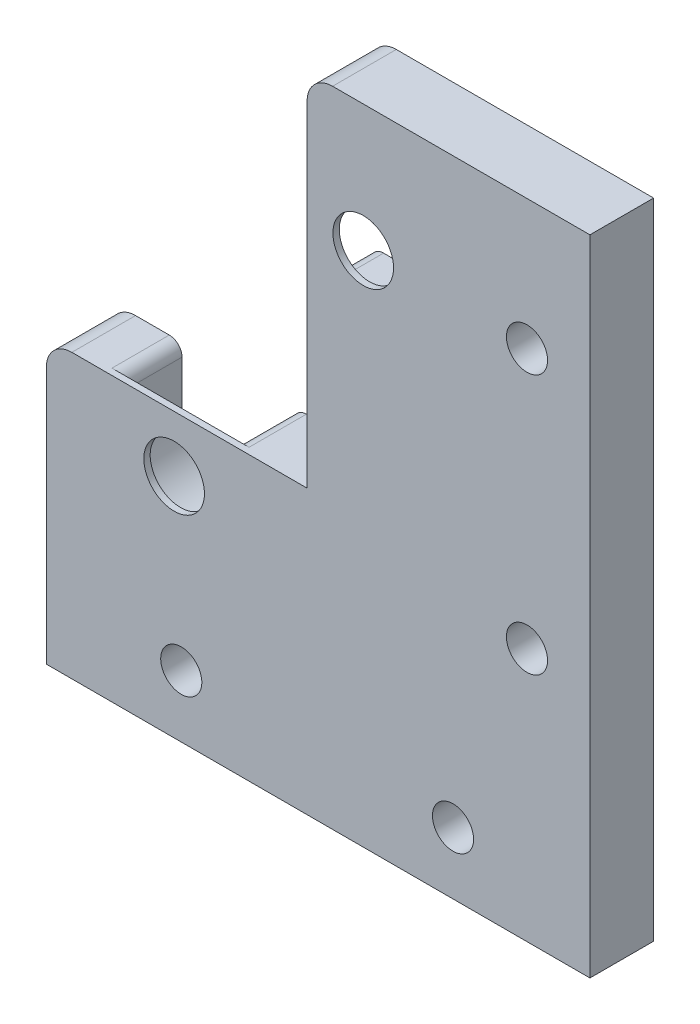
ISO-10303-21;
HEADER;
FILE_DESCRIPTION(('STEP AP214'),'2;1');
FILE_NAME('part.step','',(''),(''),'','','');
FILE_SCHEMA(('AUTOMOTIVE_DESIGN { 1 0 10303 214 1 1 1 1 }'));
ENDSEC;
DATA;
#1=APPLICATION_CONTEXT('core data for automotive mechanical design processes');
#2=APPLICATION_PROTOCOL_DEFINITION('international standard','automotive_design',2000,#1);
#3=PRODUCT_CONTEXT('',#1,'mechanical');
#4=PRODUCT('Part','Part','',(#3));
#5=PRODUCT_RELATED_PRODUCT_CATEGORY('part','',(#4));
#6=PRODUCT_DEFINITION_FORMATION('','',#4);
#7=PRODUCT_DEFINITION_CONTEXT('part definition',#1,'design');
#8=PRODUCT_DEFINITION('design','',#6,#7);
#9=PRODUCT_DEFINITION_SHAPE('','',#8);
#10=(LENGTH_UNIT() NAMED_UNIT(*) SI_UNIT(.MILLI.,.METRE.));
#11=(NAMED_UNIT(*) PLANE_ANGLE_UNIT() SI_UNIT($,.RADIAN.));
#12=(NAMED_UNIT(*) SI_UNIT($,.STERADIAN.) SOLID_ANGLE_UNIT());
#13=UNCERTAINTY_MEASURE_WITH_UNIT(LENGTH_MEASURE(1.E-05),#10,'distance_accuracy_value','');
#14=(GEOMETRIC_REPRESENTATION_CONTEXT(3) GLOBAL_UNCERTAINTY_ASSIGNED_CONTEXT((#13)) GLOBAL_UNIT_ASSIGNED_CONTEXT((#10,
#11,#12)) REPRESENTATION_CONTEXT('',''));
#15=CARTESIAN_POINT('',(0.,0.,0.));
#16=DIRECTION('',(0.,0.,1.));
#17=DIRECTION('',(1.,0.,0.));
#18=AXIS2_PLACEMENT_3D('',#15,#16,#17);
#19=CARTESIAN_POINT('',(-748.709029814981,576.941456971314,-80.6196));
#20=DIRECTION('',(0.,-1.,0.));
#21=DIRECTION('',(0.,0.,-1.));
#22=AXIS2_PLACEMENT_3D('',#19,#20,#21);
#23=PLANE('',#22);
#24=DIRECTION('',(-1.,0.,0.));
#25=VECTOR('',#24,1.);
#26=CARTESIAN_POINT('',(-748.709029814981,576.941456971314,-78.0796));
#27=LINE('',#26,#25);
#28=CARTESIAN_POINT('',(-748.150229814981,576.941456971314,-78.0796));
#29=VERTEX_POINT('',#28);
#30=CARTESIAN_POINT('',(-771.604989749061,576.941456971314,-78.0796));
#31=VERTEX_POINT('',#30);
#32=EDGE_CURVE('E376',#29,#31,#27,.T.);
#33=ORIENTED_EDGE('',*,*,#32,.F.);
#34=DIRECTION('',(0.,0.,1.));
#35=VECTOR('',#34,1.);
#36=CARTESIAN_POINT('',(-748.150229814981,576.941456971314,-80.6196));
#37=LINE('',#36,#35);
#38=CARTESIAN_POINT('',(-748.150229814981,576.941456971314,-84.4296));
#39=VERTEX_POINT('',#38);
#40=EDGE_CURVE('E390',#39,#29,#37,.T.);
#41=ORIENTED_EDGE('',*,*,#40,.F.);
#42=DIRECTION('',(-1.,0.,0.));
#43=VECTOR('',#42,1.);
#44=CARTESIAN_POINT('',(-748.150229814981,576.941456971314,-84.4296));
#45=LINE('',#44,#43);
#46=CARTESIAN_POINT('',(-754.576429814981,576.941456971314,-84.4296));
#47=VERTEX_POINT('',#46);
#48=EDGE_CURVE('E255',#39,#47,#45,.T.);
#49=ORIENTED_EDGE('',*,*,#48,.T.);
#50=DIRECTION('',(0.,0.,-1.));
#51=VECTOR('',#50,1.);
#52=CARTESIAN_POINT('',(-754.576429814981,576.941456971314,-80.6196));
#53=LINE('',#52,#51);
#54=CARTESIAN_POINT('',(-754.576429814981,576.941456971314,-78.7146));
#55=VERTEX_POINT('',#54);
#56=EDGE_CURVE('E433',#55,#47,#53,.T.);
#57=ORIENTED_EDGE('',*,*,#56,.F.);
#58=DIRECTION('',(-1.,0.,0.));
#59=VECTOR('',#58,1.);
#60=CARTESIAN_POINT('',(-1553.36997949812,576.941456971314,-78.7146));
#61=LINE('',#60,#59);
#62=CARTESIAN_POINT('',(-768.241629814981,576.941456971314,-78.7146));
#63=VERTEX_POINT('',#62);
#64=EDGE_CURVE('E293',#55,#63,#61,.T.);
#65=ORIENTED_EDGE('',*,*,#64,.T.);
#66=DIRECTION('',(0.,0.,-1.));
#67=VECTOR('',#66,1.);
#68=CARTESIAN_POINT('',(-768.241629814981,576.941456971314,-78.7146));
#69=LINE('',#68,#67);
#70=CARTESIAN_POINT('',(-768.241629814981,576.941456971314,-84.4296));
#71=VERTEX_POINT('',#70);
#72=EDGE_CURVE('E429',#71,#63,#69,.F.);
#73=ORIENTED_EDGE('',*,*,#72,.F.);
#74=CARTESIAN_POINT('',(-771.604989749061,576.941456971314,-84.4296));
#75=VERTEX_POINT('',#74);
#76=EDGE_CURVE('E357',#71,#75,#45,.T.);
#77=ORIENTED_EDGE('',*,*,#76,.T.);
#78=DIRECTION('',(0.,0.,1.));
#79=VECTOR('',#78,1.);
#80=CARTESIAN_POINT('',(-771.604989749061,576.941456971314,-84.4296));
#81=LINE('',#80,#79);
#82=EDGE_CURVE('E465',#31,#75,#81,.F.);
#83=ORIENTED_EDGE('',*,*,#82,.F.);
#84=EDGE_LOOP('',(#33,#41,#49,#57,#65,#73,#77,#83));
#85=FACE_BOUND('',#84,.T.);
#86=ADVANCED_FACE('F91',(#85),#23,.F.);
#87=CARTESIAN_POINT('',(-748.150229814981,612.913454217726,-80.6196));
#88=DIRECTION('',(1.,0.,0.));
#89=DIRECTION('',(0.,0.,1.));
#90=AXIS2_PLACEMENT_3D('',#87,#88,#89);
#91=PLANE('',#90);
#92=DIRECTION('',(0.,-1.,0.));
#93=VECTOR('',#92,1.);
#94=CARTESIAN_POINT('',(-748.150229814981,612.913454217726,-84.4296));
#95=LINE('',#94,#93);
#96=CARTESIAN_POINT('',(-748.150229814981,610.373454217725,-84.4296));
#97=VERTEX_POINT('',#96);
#98=CARTESIAN_POINT('',(-748.150229814981,607.091256971314,-84.4296));
#99=VERTEX_POINT('',#98);
#100=EDGE_CURVE('E353',#97,#99,#95,.T.);
#101=ORIENTED_EDGE('',*,*,#100,.T.);
#102=DIRECTION('',(0.,0.,-1.));
#103=VECTOR('',#102,1.);
#104=CARTESIAN_POINT('',(-748.150229814981,607.091256971314,-80.6196));
#105=LINE('',#104,#103);
#106=CARTESIAN_POINT('',(-748.150229814981,607.091256971314,-78.7146));
#107=VERTEX_POINT('',#106);
#108=EDGE_CURVE('E405',#107,#99,#105,.T.);
#109=ORIENTED_EDGE('',*,*,#108,.F.);
#110=DIRECTION('',(0.,-1.,0.));
#111=VECTOR('',#110,1.);
#112=CARTESIAN_POINT('',(-748.150229814981,0.,-78.7146));
#113=LINE('',#112,#111);
#114=CARTESIAN_POINT('',(-748.150229814981,593.426056971314,-78.7146));
#115=VERTEX_POINT('',#114);
#116=EDGE_CURVE('E342',#107,#115,#113,.T.);
#117=ORIENTED_EDGE('',*,*,#116,.T.);
#118=DIRECTION('',(0.,0.,-1.));
#119=VECTOR('',#118,1.);
#120=CARTESIAN_POINT('',(-748.150229814981,593.426056971314,-78.7146));
#121=LINE('',#120,#119);
#122=CARTESIAN_POINT('',(-748.150229814981,593.426056971314,-84.4296));
#123=VERTEX_POINT('',#122);
#124=EDGE_CURVE('E394',#123,#115,#121,.F.);
#125=ORIENTED_EDGE('',*,*,#124,.F.);
#126=EDGE_CURVE('E358',#123,#39,#95,.T.);
#127=ORIENTED_EDGE('',*,*,#126,.T.);
#128=ORIENTED_EDGE('',*,*,#40,.T.);
#129=DIRECTION('',(0.,-1.,0.));
#130=VECTOR('',#129,1.);
#131=CARTESIAN_POINT('',(-748.150229814981,612.913454217726,-78.0796));
#132=LINE('',#131,#130);
#133=CARTESIAN_POINT('',(-748.150229814981,610.373454217725,-78.0796));
#134=VERTEX_POINT('',#133);
#135=EDGE_CURVE('E387',#134,#29,#132,.T.);
#136=ORIENTED_EDGE('',*,*,#135,.F.);
#137=DIRECTION('',(0.,0.,1.));
#138=VECTOR('',#137,1.);
#139=CARTESIAN_POINT('',(-748.150229814981,610.373454217725,-78.0796));
#140=LINE('',#139,#138);
#141=EDGE_CURVE('E474',#97,#134,#140,.T.);
#142=ORIENTED_EDGE('',*,*,#141,.F.);
#143=EDGE_LOOP('',(#101,#109,#117,#125,#127,#128,#136,#142));
#144=FACE_BOUND('',#143,.T.);
#145=ADVANCED_FACE('F521',(#144),#91,.F.);
#146=CARTESIAN_POINT('',(-761.409029814981,571.347106971314,-78.0796));
#147=DIRECTION('',(0.,0.,-1.));
#148=DIRECTION('',(1.,0.,0.));
#149=AXIS2_PLACEMENT_3D('',#146,#147,#148);
#150=CYLINDRICAL_SURFACE('',#149,3.0226);
#151=CARTESIAN_POINT('',(-761.409029814981,571.347106971314,-78.7146));
#152=DIRECTION('',(0.,0.,1.));
#153=DIRECTION('',(1.,0.,0.));
#154=AXIS2_PLACEMENT_3D('',#151,#152,#153);
#155=CIRCLE('',#154,3.0226);
#156=CARTESIAN_POINT('',(-758.386429814981,571.347106971314,-78.7146));
#157=VERTEX_POINT('',#156);
#158=EDGE_CURVE('E398',#157,#157,#155,.F.);
#159=ORIENTED_EDGE('',*,*,#158,.T.);
#160=DIRECTION('',(0.,0.,-1.));
#161=VECTOR('',#160,1.);
#162=CARTESIAN_POINT('',(-758.386429814981,571.347106971314,-78.0796));
#163=LINE('',#162,#161);
#164=CARTESIAN_POINT('',(-758.386429814981,571.347106971314,-78.0796));
#165=VERTEX_POINT('',#164);
#166=EDGE_CURVE('E373',#165,#157,#163,.T.);
#167=ORIENTED_EDGE('',*,*,#166,.F.);
#168=CARTESIAN_POINT('',(-761.409029814981,571.347106971314,-78.0796));
#169=DIRECTION('',(0.,0.,-1.));
#170=DIRECTION('',(1.,0.,0.));
#171=AXIS2_PLACEMENT_3D('',#168,#169,#170);
#172=CIRCLE('',#171,3.0226);
#173=EDGE_CURVE('E370',#165,#165,#172,.T.);
#174=ORIENTED_EDGE('',*,*,#173,.F.);
#175=ORIENTED_EDGE('',*,*,#166,.T.);
#176=EDGE_LOOP('',(#159,#167,#174,#175));
#177=FACE_BOUND('',#176,.T.);
#178=ADVANCED_FACE('F527',(#177),#150,.F.);
#179=CARTESIAN_POINT('',(-742.555879814981,600.258656971314,-78.0796));
#180=DIRECTION('',(0.,0.,-1.));
#181=DIRECTION('',(1.,0.,0.));
#182=AXIS2_PLACEMENT_3D('',#179,#180,#181);
#183=CYLINDRICAL_SURFACE('',#182,3.0226);
#184=CARTESIAN_POINT('',(-742.555879814981,600.258656971314,-78.7146));
#185=DIRECTION('',(0.,0.,1.));
#186=DIRECTION('',(1.,0.,0.));
#187=AXIS2_PLACEMENT_3D('',#184,#185,#186);
#188=CIRCLE('',#187,3.0226);
#189=CARTESIAN_POINT('',(-739.53327981498,600.258656971314,-78.7146));
#190=VERTEX_POINT('',#189);
#191=EDGE_CURVE('E317',#190,#190,#188,.F.);
#192=ORIENTED_EDGE('',*,*,#191,.T.);
#193=DIRECTION('',(0.,0.,-1.));
#194=VECTOR('',#193,1.);
#195=CARTESIAN_POINT('',(-739.53327981498,600.258656971314,-78.0796));
#196=LINE('',#195,#194);
#197=CARTESIAN_POINT('',(-739.533279814981,600.258656971314,-78.0796));
#198=VERTEX_POINT('',#197);
#199=EDGE_CURVE('E367',#198,#190,#196,.T.);
#200=ORIENTED_EDGE('',*,*,#199,.F.);
#201=CARTESIAN_POINT('',(-742.555879814981,600.258656971314,-78.0796));
#202=DIRECTION('',(0.,0.,-1.));
#203=DIRECTION('',(1.,0.,0.));
#204=AXIS2_PLACEMENT_3D('',#201,#202,#203);
#205=CIRCLE('',#204,3.0226);
#206=EDGE_CURVE('E364',#198,#198,#205,.T.);
#207=ORIENTED_EDGE('',*,*,#206,.F.);
#208=ORIENTED_EDGE('',*,*,#199,.T.);
#209=EDGE_LOOP('',(#192,#200,#207,#208));
#210=FACE_BOUND('',#209,.T.);
#211=ADVANCED_FACE('F510',(#210),#183,.F.);
#212=CARTESIAN_POINT('',(-1553.36997949812,0.,-84.4296));
#213=DIRECTION('',(0.,0.,1.));
#214=DIRECTION('',(-1.,0.,0.));
#215=AXIS2_PLACEMENT_3D('',#212,#213,#214);
#216=PLANE('',#215);
#217=CARTESIAN_POINT('',(-760.699399765524,554.919656971296,-84.4296));
#218=DIRECTION('',(0.,0.,1.));
#219=DIRECTION('',(1.,0.,0.));
#220=AXIS2_PLACEMENT_3D('',#217,#218,#219);
#221=CIRCLE('',#220,3.31999999999999);
#222=CARTESIAN_POINT('',(-757.379399765524,554.919656971296,-84.4296));
#223=VERTEX_POINT('',#222);
#224=EDGE_CURVE('E488',#223,#223,#221,.T.);
#225=ORIENTED_EDGE('',*,*,#224,.T.);
#226=EDGE_LOOP('',(#225));
#227=FACE_BOUND('',#226,.T.);
#228=CARTESIAN_POINT('',(-733.605019798484,554.919656971296,-84.4296));
#229=DIRECTION('',(0.,0.,1.));
#230=DIRECTION('',(1.,0.,0.));
#231=AXIS2_PLACEMENT_3D('',#228,#229,#230);
#232=CIRCLE('',#231,3.31999999999999);
#233=CARTESIAN_POINT('',(-730.285019798484,554.919656971296,-84.4296));
#234=VERTEX_POINT('',#233);
#235=EDGE_CURVE('E485',#234,#234,#232,.T.);
#236=ORIENTED_EDGE('',*,*,#235,.T.);
#237=EDGE_LOOP('',(#236));
#238=FACE_BOUND('',#237,.T.);
#239=CARTESIAN_POINT('',(-726.230029814964,574.047256282899,-84.4296));
#240=DIRECTION('',(0.,0.,1.));
#241=DIRECTION('',(1.,0.,0.));
#242=AXIS2_PLACEMENT_3D('',#239,#240,#241);
#243=CIRCLE('',#242,3.31999999999999);
#244=CARTESIAN_POINT('',(-722.910029814964,574.047256282899,-84.4296));
#245=VERTEX_POINT('',#244);
#246=EDGE_CURVE('E482',#245,#245,#243,.T.);
#247=ORIENTED_EDGE('',*,*,#246,.T.);
#248=EDGE_LOOP('',(#247));
#249=FACE_BOUND('',#248,.T.);
#250=CARTESIAN_POINT('',(-726.230029814964,599.958054906104,-84.4296));
#251=DIRECTION('',(0.,0.,1.));
#252=DIRECTION('',(1.,0.,0.));
#253=AXIS2_PLACEMENT_3D('',#250,#251,#252);
#254=CIRCLE('',#253,3.31999999999999);
#255=CARTESIAN_POINT('',(-722.910029814964,599.958054906104,-84.4296));
#256=VERTEX_POINT('',#255);
#257=EDGE_CURVE('E479',#256,#256,#254,.T.);
#258=ORIENTED_EDGE('',*,*,#257,.T.);
#259=EDGE_LOOP('',(#258));
#260=FACE_BOUND('',#259,.T.);
#261=DIRECTION('',(-1.,0.,0.));
#262=VECTOR('',#261,1.);
#263=CARTESIAN_POINT('',(-726.30622981498,612.913454217726,-84.4296));
#264=LINE('',#263,#262);
#265=CARTESIAN_POINT('',(-719.956229814987,612.91345421773,-84.4296));
#266=VERTEX_POINT('',#265);
#267=CARTESIAN_POINT('',(-745.610229814981,612.913454217726,-84.4296));
#268=VERTEX_POINT('',#267);
#269=EDGE_CURVE('E254',#266,#268,#264,.T.);
#270=ORIENTED_EDGE('',*,*,#269,.F.);
#271=DIRECTION('',(0.,-1.,0.));
#272=VECTOR('',#271,1.);
#273=CARTESIAN_POINT('',(-719.956229815,2.51751805689119E-11,-84.4296));
#274=LINE('',#273,#272);
#275=CARTESIAN_POINT('',(-719.95622981498,548.747456971314,-84.4296));
#276=VERTEX_POINT('',#275);
#277=EDGE_CURVE('E266',#266,#276,#274,.T.);
#278=ORIENTED_EDGE('',*,*,#277,.T.);
#279=DIRECTION('',(-1.,0.,0.));
#280=VECTOR('',#279,1.);
#281=CARTESIAN_POINT('',(0.,548.747456971314,-84.4296));
#282=LINE('',#281,#280);
#283=CARTESIAN_POINT('',(-774.144989749061,548.747456971314,-84.4296));
#284=VERTEX_POINT('',#283);
#285=EDGE_CURVE('E262',#276,#284,#282,.T.);
#286=ORIENTED_EDGE('',*,*,#285,.T.);
#287=DIRECTION('',(0.,-1.,0.));
#288=VECTOR('',#287,1.);
#289=CARTESIAN_POINT('',(-774.144989749061,576.941456971314,-84.4296));
#290=LINE('',#289,#288);
#291=CARTESIAN_POINT('',(-774.144989749061,574.401456971314,-84.4296));
#292=VERTEX_POINT('',#291);
#293=EDGE_CURVE('E243',#292,#284,#290,.T.);
#294=ORIENTED_EDGE('',*,*,#293,.F.);
#295=CARTESIAN_POINT('',(-771.604989749061,574.401456971314,-84.4296));
#296=DIRECTION('',(0.,0.,-1.));
#297=DIRECTION('',(-1.,0.,0.));
#298=AXIS2_PLACEMENT_3D('',#295,#296,#297);
#299=CIRCLE('',#298,2.54);
#300=EDGE_CURVE('E471',#75,#292,#299,.F.);
#301=ORIENTED_EDGE('',*,*,#300,.F.);
#302=ORIENTED_EDGE('',*,*,#76,.F.);
#303=CARTESIAN_POINT('',(-768.241629814981,575.671456971314,-84.4296));
#304=DIRECTION('',(0.,0.,-1.));
#305=DIRECTION('',(-1.,0.,0.));
#306=AXIS2_PLACEMENT_3D('',#303,#304,#305);
#307=CIRCLE('',#306,1.27);
#308=CARTESIAN_POINT('',(-766.971629814981,575.671456971314,-84.4296));
#309=VERTEX_POINT('',#308);
#310=EDGE_CURVE('E409',#309,#71,#307,.F.);
#311=ORIENTED_EDGE('',*,*,#310,.F.);
#312=DIRECTION('',(0.,1.,0.));
#313=VECTOR('',#312,1.);
#314=CARTESIAN_POINT('',(-766.971629814981,0.,-84.4296));
#315=LINE('',#314,#313);
#316=CARTESIAN_POINT('',(-766.971629814981,571.347106971314,-84.4296));
#317=VERTEX_POINT('',#316);
#318=EDGE_CURVE('E289',#317,#309,#315,.T.);
#319=ORIENTED_EDGE('',*,*,#318,.F.);
#320=CARTESIAN_POINT('',(-761.409029814981,571.347106971314,-84.4296));
#321=DIRECTION('',(0.,0.,1.));
#322=DIRECTION('',(1.,0.,0.));
#323=AXIS2_PLACEMENT_3D('',#320,#321,#322);
#324=CIRCLE('',#323,5.5626);
#325=CARTESIAN_POINT('',(-755.846429814981,571.347106971314,-84.4296));
#326=VERTEX_POINT('',#325);
#327=EDGE_CURVE('E302',#317,#326,#324,.T.);
#328=ORIENTED_EDGE('',*,*,#327,.T.);
#329=DIRECTION('',(0.,1.,0.));
#330=VECTOR('',#329,1.);
#331=CARTESIAN_POINT('',(-755.846429814981,0.,-84.4296));
#332=LINE('',#331,#330);
#333=CARTESIAN_POINT('',(-755.846429814981,575.671456971314,-84.4296));
#334=VERTEX_POINT('',#333);
#335=EDGE_CURVE('E306',#326,#334,#332,.T.);
#336=ORIENTED_EDGE('',*,*,#335,.T.);
#337=CARTESIAN_POINT('',(-754.576429814981,575.671456971314,-84.4296));
#338=DIRECTION('',(0.,0.,-1.));
#339=DIRECTION('',(-1.,0.,0.));
#340=AXIS2_PLACEMENT_3D('',#337,#338,#339);
#341=CIRCLE('',#340,1.27);
#342=EDGE_CURVE('E412',#47,#334,#341,.F.);
#343=ORIENTED_EDGE('',*,*,#342,.F.);
#344=ORIENTED_EDGE('',*,*,#48,.F.);
#345=ORIENTED_EDGE('',*,*,#126,.F.);
#346=CARTESIAN_POINT('',(-746.880229814981,593.426056971314,-84.4296));
#347=DIRECTION('',(0.,0.,-1.));
#348=DIRECTION('',(-1.,0.,0.));
#349=AXIS2_PLACEMENT_3D('',#346,#347,#348);
#350=CIRCLE('',#349,1.27);
#351=CARTESIAN_POINT('',(-746.880229814981,594.696056971314,-84.4296));
#352=VERTEX_POINT('',#351);
#353=EDGE_CURVE('E416',#352,#123,#350,.F.);
#354=ORIENTED_EDGE('',*,*,#353,.F.);
#355=DIRECTION('',(-1.,0.,0.));
#356=VECTOR('',#355,1.);
#357=CARTESIAN_POINT('',(-1553.36997949812,594.696056971314,-84.4296));
#358=LINE('',#357,#356);
#359=CARTESIAN_POINT('',(-742.555879814981,594.696056971314,-84.4296));
#360=VERTEX_POINT('',#359);
#361=EDGE_CURVE('E327',#360,#352,#358,.T.);
#362=ORIENTED_EDGE('',*,*,#361,.F.);
#363=CARTESIAN_POINT('',(-742.555879814981,600.258656971314,-84.4296));
#364=DIRECTION('',(0.,0.,1.));
#365=DIRECTION('',(1.,0.,0.));
#366=AXIS2_PLACEMENT_3D('',#363,#364,#365);
#367=CIRCLE('',#366,5.56260000000014);
#368=CARTESIAN_POINT('',(-742.555879814981,605.821256971314,-84.4296));
#369=VERTEX_POINT('',#368);
#370=EDGE_CURVE('E307',#360,#369,#367,.T.);
#371=ORIENTED_EDGE('',*,*,#370,.T.);
#372=DIRECTION('',(-1.,0.,0.));
#373=VECTOR('',#372,1.);
#374=CARTESIAN_POINT('',(-1553.36997949812,605.821256971314,-84.4296));
#375=LINE('',#374,#373);
#376=CARTESIAN_POINT('',(-746.880229814981,605.821256971314,-84.4296));
#377=VERTEX_POINT('',#376);
#378=EDGE_CURVE('E331',#369,#377,#375,.T.);
#379=ORIENTED_EDGE('',*,*,#378,.T.);
#380=CARTESIAN_POINT('',(-746.880229814981,607.091256971314,-84.4296));
#381=DIRECTION('',(0.,0.,-1.));
#382=DIRECTION('',(-1.,0.,0.));
#383=AXIS2_PLACEMENT_3D('',#380,#381,#382);
#384=CIRCLE('',#383,1.27);
#385=EDGE_CURVE('E419',#99,#377,#384,.F.);
#386=ORIENTED_EDGE('',*,*,#385,.F.);
#387=ORIENTED_EDGE('',*,*,#100,.F.);
#388=CARTESIAN_POINT('',(-745.610229814981,610.373454217725,-84.4296));
#389=DIRECTION('',(0.,0.,-1.));
#390=DIRECTION('',(-1.,0.,0.));
#391=AXIS2_PLACEMENT_3D('',#388,#389,#390);
#392=CIRCLE('',#391,2.54);
#393=EDGE_CURVE('E112',#268,#97,#392,.F.);
#394=ORIENTED_EDGE('',*,*,#393,.F.);
#395=EDGE_LOOP('',(#270,#278,#286,#294,#301,#302,#311,#319,#328,#336,#343,#344,#345,#354,#362,
#371,#379,#386,#387,#394));
#396=FACE_BOUND('',#395,.T.);
#397=ADVANCED_FACE('F268',(#227,#238,#249,#260,#396),#216,.F.);
#398=CARTESIAN_POINT('',(-774.144989749061,0.,6.35));
#399=DIRECTION('',(-1.,0.,0.));
#400=DIRECTION('',(0.,0.,-1.));
#401=AXIS2_PLACEMENT_3D('',#398,#399,#400);
#402=PLANE('',#401);
#403=DIRECTION('',(0.,-1.,0.));
#404=VECTOR('',#403,1.);
#405=CARTESIAN_POINT('',(-774.144989749061,562.158656971314,-78.0796));
#406=LINE('',#405,#404);
#407=CARTESIAN_POINT('',(-774.144989749061,574.401456971314,-78.0796));
#408=VERTEX_POINT('',#407);
#409=CARTESIAN_POINT('',(-774.144989749061,548.747456971314,-78.0796));
#410=VERTEX_POINT('',#409);
#411=EDGE_CURVE('E380',#408,#410,#406,.T.);
#412=ORIENTED_EDGE('',*,*,#411,.F.);
#413=DIRECTION('',(0.,0.,1.));
#414=VECTOR('',#413,1.);
#415=CARTESIAN_POINT('',(-774.144989749061,574.401456971314,-78.0796));
#416=LINE('',#415,#414);
#417=EDGE_CURVE('E249',#292,#408,#416,.T.);
#418=ORIENTED_EDGE('',*,*,#417,.F.);
#419=ORIENTED_EDGE('',*,*,#293,.T.);
#420=DIRECTION('',(0.,0.,-1.));
#421=VECTOR('',#420,1.);
#422=CARTESIAN_POINT('',(-774.144989749061,548.747456971314,5.90668998723819));
#423=LINE('',#422,#421);
#424=EDGE_CURVE('E247',#410,#284,#423,.T.);
#425=ORIENTED_EDGE('',*,*,#424,.F.);
#426=EDGE_LOOP('',(#412,#418,#419,#425));
#427=FACE_BOUND('',#426,.T.);
#428=ADVANCED_FACE('F246',(#427),#402,.T.);
#429=CARTESIAN_POINT('',(-1553.36997949812,612.913454217726,6.35));
#430=DIRECTION('',(0.,1.,0.));
#431=DIRECTION('',(0.,0.,1.));
#432=AXIS2_PLACEMENT_3D('',#429,#430,#431);
#433=PLANE('',#432);
#434=DIRECTION('',(-1.,0.,0.));
#435=VECTOR('',#434,1.);
#436=CARTESIAN_POINT('',(-733.367429814981,612.913454217726,-78.0796));
#437=LINE('',#436,#435);
#438=CARTESIAN_POINT('',(-719.956229814987,612.91345421773,-78.0796));
#439=VERTEX_POINT('',#438);
#440=CARTESIAN_POINT('',(-745.610229814981,612.913454217726,-78.0796));
#441=VERTEX_POINT('',#440);
#442=EDGE_CURVE('E383',#439,#441,#437,.T.);
#443=ORIENTED_EDGE('',*,*,#442,.F.);
#444=DIRECTION('',(0.,0.,-1.));
#445=VECTOR('',#444,1.);
#446=CARTESIAN_POINT('',(-719.956229814987,612.91345421773,5.90668998723819));
#447=LINE('',#446,#445);
#448=EDGE_CURVE('E265',#439,#266,#447,.T.);
#449=ORIENTED_EDGE('',*,*,#448,.T.);
#450=ORIENTED_EDGE('',*,*,#269,.T.);
#451=DIRECTION('',(0.,0.,1.));
#452=VECTOR('',#451,1.);
#453=CARTESIAN_POINT('',(-745.610229814981,612.913454217726,-84.4296));
#454=LINE('',#453,#452);
#455=EDGE_CURVE('E107',#441,#268,#454,.F.);
#456=ORIENTED_EDGE('',*,*,#455,.F.);
#457=EDGE_LOOP('',(#443,#449,#450,#456));
#458=FACE_BOUND('',#457,.T.);
#459=ADVANCED_FACE('F533',(#458),#433,.T.);
#460=CARTESIAN_POINT('',(-1553.36997949812,0.,-78.0796));
#461=DIRECTION('',(0.,0.,-1.));
#462=DIRECTION('',(1.,0.,0.));
#463=AXIS2_PLACEMENT_3D('',#460,#461,#462);
#464=PLANE('',#463);
#465=CARTESIAN_POINT('',(-760.699399765524,554.919656971296,-78.0796));
#466=DIRECTION('',(0.,0.,-1.));
#467=DIRECTION('',(-1.,0.,0.));
#468=AXIS2_PLACEMENT_3D('',#465,#466,#467);
#469=CIRCLE('',#468,2.05000000000004);
#470=CARTESIAN_POINT('',(-762.749399765524,554.919656971296,-78.0796));
#471=VERTEX_POINT('',#470);
#472=EDGE_CURVE('E270',#471,#471,#469,.F.);
#473=ORIENTED_EDGE('',*,*,#472,.F.);
#474=EDGE_LOOP('',(#473));
#475=FACE_BOUND('',#474,.T.);
#476=CARTESIAN_POINT('',(-733.605019798484,554.919656971296,-78.0796));
#477=DIRECTION('',(0.,0.,-1.));
#478=DIRECTION('',(-1.,0.,0.));
#479=AXIS2_PLACEMENT_3D('',#476,#477,#478);
#480=CIRCLE('',#479,2.05000000000004);
#481=CARTESIAN_POINT('',(-735.655019798484,554.919656971296,-78.0796));
#482=VERTEX_POINT('',#481);
#483=EDGE_CURVE('E274',#482,#482,#480,.F.);
#484=ORIENTED_EDGE('',*,*,#483,.F.);
#485=EDGE_LOOP('',(#484));
#486=FACE_BOUND('',#485,.T.);
#487=CARTESIAN_POINT('',(-726.230029814964,574.047256282899,-78.0796));
#488=DIRECTION('',(0.,0.,-1.));
#489=DIRECTION('',(-1.,0.,0.));
#490=AXIS2_PLACEMENT_3D('',#487,#488,#489);
#491=CIRCLE('',#490,2.05000000000004);
#492=CARTESIAN_POINT('',(-728.280029814964,574.047256282899,-78.0796));
#493=VERTEX_POINT('',#492);
#494=EDGE_CURVE('E596',#493,#493,#491,.F.);
#495=ORIENTED_EDGE('',*,*,#494,.F.);
#496=EDGE_LOOP('',(#495));
#497=FACE_BOUND('',#496,.T.);
#498=CARTESIAN_POINT('',(-726.230029814964,599.958054906104,-78.0796));
#499=DIRECTION('',(0.,0.,-1.));
#500=DIRECTION('',(-1.,0.,0.));
#501=AXIS2_PLACEMENT_3D('',#498,#499,#500);
#502=CIRCLE('',#501,2.05000000000004);
#503=CARTESIAN_POINT('',(-728.280029814964,599.958054906104,-78.0796));
#504=VERTEX_POINT('',#503);
#505=EDGE_CURVE('E599',#504,#504,#502,.F.);
#506=ORIENTED_EDGE('',*,*,#505,.F.);
#507=EDGE_LOOP('',(#506));
#508=FACE_BOUND('',#507,.T.);
#509=ORIENTED_EDGE('',*,*,#442,.T.);
#510=CARTESIAN_POINT('',(-745.610229814981,610.373454217725,-78.0796));
#511=DIRECTION('',(0.,0.,1.));
#512=DIRECTION('',(1.,0.,0.));
#513=AXIS2_PLACEMENT_3D('',#510,#511,#512);
#514=CIRCLE('',#513,2.54);
#515=EDGE_CURVE('E459',#134,#441,#514,.F.);
#516=ORIENTED_EDGE('',*,*,#515,.F.);
#517=ORIENTED_EDGE('',*,*,#135,.T.);
#518=ORIENTED_EDGE('',*,*,#32,.T.);
#519=CARTESIAN_POINT('',(-771.604989749061,574.401456971314,-78.0796));
#520=DIRECTION('',(0.,0.,1.));
#521=DIRECTION('',(1.,0.,0.));
#522=AXIS2_PLACEMENT_3D('',#519,#520,#521);
#523=CIRCLE('',#522,2.54);
#524=EDGE_CURVE('E462',#408,#31,#523,.F.);
#525=ORIENTED_EDGE('',*,*,#524,.F.);
#526=ORIENTED_EDGE('',*,*,#411,.T.);
#527=DIRECTION('',(1.,0.,0.));
#528=VECTOR('',#527,1.);
#529=CARTESIAN_POINT('',(0.,548.747456971314,-78.0796));
#530=LINE('',#529,#528);
#531=CARTESIAN_POINT('',(-719.95622981498,548.747456971314,-78.0796));
#532=VERTEX_POINT('',#531);
#533=EDGE_CURVE('E264',#410,#532,#530,.T.);
#534=ORIENTED_EDGE('',*,*,#533,.T.);
#535=DIRECTION('',(0.,1.,0.));
#536=VECTOR('',#535,1.);
#537=CARTESIAN_POINT('',(-719.956229815,2.51751805689119E-11,-78.0796));
#538=LINE('',#537,#536);
#539=EDGE_CURVE('E281',#532,#439,#538,.T.);
#540=ORIENTED_EDGE('',*,*,#539,.T.);
#541=EDGE_LOOP('',(#509,#516,#517,#518,#525,#526,#534,#540));
#542=FACE_BOUND('',#541,.T.);
#543=ORIENTED_EDGE('',*,*,#206,.T.);
#544=EDGE_LOOP('',(#543));
#545=FACE_BOUND('',#544,.T.);
#546=ORIENTED_EDGE('',*,*,#173,.T.);
#547=EDGE_LOOP('',(#546));
#548=FACE_BOUND('',#547,.T.);
#549=ADVANCED_FACE('F536',(#475,#486,#497,#508,#542,#545,#548),#464,.F.);
#550=CARTESIAN_POINT('',(-1553.36997949812,0.,-78.7146));
#551=DIRECTION('',(0.,0.,-1.));
#552=DIRECTION('',(1.,0.,0.));
#553=AXIS2_PLACEMENT_3D('',#550,#551,#552);
#554=PLANE('',#553);
#555=CARTESIAN_POINT('',(-742.555879814981,600.258656971314,-78.7146));
#556=DIRECTION('',(0.,0.,1.));
#557=DIRECTION('',(1.,0.,0.));
#558=AXIS2_PLACEMENT_3D('',#555,#556,#557);
#559=CIRCLE('',#558,5.56260000000014);
#560=CARTESIAN_POINT('',(-742.555879814981,594.696056971314,-78.7146));
#561=VERTEX_POINT('',#560);
#562=CARTESIAN_POINT('',(-742.555879814981,605.821256971314,-78.7146));
#563=VERTEX_POINT('',#562);
#564=EDGE_CURVE('E332',#561,#563,#559,.T.);
#565=ORIENTED_EDGE('',*,*,#564,.F.);
#566=DIRECTION('',(-1.,0.,0.));
#567=VECTOR('',#566,1.);
#568=CARTESIAN_POINT('',(-1553.36997949812,594.696056971314,-78.7146));
#569=LINE('',#568,#567);
#570=CARTESIAN_POINT('',(-746.880229814981,594.696056971314,-78.7146));
#571=VERTEX_POINT('',#570);
#572=EDGE_CURVE('E323',#561,#571,#569,.T.);
#573=ORIENTED_EDGE('',*,*,#572,.T.);
#574=CARTESIAN_POINT('',(-746.880229814981,593.426056971314,-78.7146));
#575=DIRECTION('',(0.,0.,1.));
#576=DIRECTION('',(1.,0.,0.));
#577=AXIS2_PLACEMENT_3D('',#574,#575,#576);
#578=CIRCLE('',#577,1.27);
#579=EDGE_CURVE('E446',#115,#571,#578,.F.);
#580=ORIENTED_EDGE('',*,*,#579,.F.);
#581=ORIENTED_EDGE('',*,*,#116,.F.);
#582=CARTESIAN_POINT('',(-746.880229814981,607.091256971314,-78.7146));
#583=DIRECTION('',(0.,0.,1.));
#584=DIRECTION('',(1.,0.,0.));
#585=AXIS2_PLACEMENT_3D('',#582,#583,#584);
#586=CIRCLE('',#585,1.27);
#587=CARTESIAN_POINT('',(-746.880229814981,605.821256971314,-78.7146));
#588=VERTEX_POINT('',#587);
#589=EDGE_CURVE('E443',#588,#107,#586,.F.);
#590=ORIENTED_EDGE('',*,*,#589,.F.);
#591=DIRECTION('',(-1.,0.,0.));
#592=VECTOR('',#591,1.);
#593=CARTESIAN_POINT('',(-1553.36997949812,605.821256971314,-78.7146));
#594=LINE('',#593,#592);
#595=EDGE_CURVE('E346',#563,#588,#594,.T.);
#596=ORIENTED_EDGE('',*,*,#595,.F.);
#597=EDGE_LOOP('',(#565,#573,#580,#581,#590,#596));
#598=FACE_BOUND('',#597,.T.);
#599=ORIENTED_EDGE('',*,*,#191,.F.);
#600=EDGE_LOOP('',(#599));
#601=FACE_BOUND('',#600,.T.);
#602=ADVANCED_FACE('F654',(#598,#601),#554,.T.);
#603=CARTESIAN_POINT('',(-742.555879814981,600.258656971314,-78.7146));
#604=DIRECTION('',(0.,0.,-1.));
#605=DIRECTION('',(1.,0.,0.));
#606=AXIS2_PLACEMENT_3D('',#603,#604,#605);
#607=CYLINDRICAL_SURFACE('',#606,5.56260000000014);
#608=ORIENTED_EDGE('',*,*,#370,.F.);
#609=DIRECTION('',(0.,0.,-1.));
#610=VECTOR('',#609,1.);
#611=CARTESIAN_POINT('',(-742.555879814981,594.696056971314,-78.7146));
#612=LINE('',#611,#610);
#613=EDGE_CURVE('E324',#561,#360,#612,.T.);
#614=ORIENTED_EDGE('',*,*,#613,.F.);
#615=ORIENTED_EDGE('',*,*,#564,.T.);
#616=DIRECTION('',(0.,0.,-1.));
#617=VECTOR('',#616,1.);
#618=CARTESIAN_POINT('',(-742.555879814981,605.821256971314,-78.7146));
#619=LINE('',#618,#617);
#620=EDGE_CURVE('E320',#563,#369,#619,.T.);
#621=ORIENTED_EDGE('',*,*,#620,.T.);
#622=EDGE_LOOP('',(#608,#614,#615,#621));
#623=FACE_BOUND('',#622,.T.);
#624=ADVANCED_FACE('F647',(#623),#607,.F.);
#625=CARTESIAN_POINT('',(-1553.36997949812,594.696056971314,-78.7146));
#626=DIRECTION('',(0.,1.,0.));
#627=DIRECTION('',(0.,0.,1.));
#628=AXIS2_PLACEMENT_3D('',#625,#626,#627);
#629=PLANE('',#628);
#630=ORIENTED_EDGE('',*,*,#572,.F.);
#631=ORIENTED_EDGE('',*,*,#613,.T.);
#632=ORIENTED_EDGE('',*,*,#361,.T.);
#633=DIRECTION('',(0.,0.,-1.));
#634=VECTOR('',#633,1.);
#635=CARTESIAN_POINT('',(-746.880229814981,594.696056971314,-84.4296));
#636=LINE('',#635,#634);
#637=EDGE_CURVE('E426',#571,#352,#636,.T.);
#638=ORIENTED_EDGE('',*,*,#637,.F.);
#639=EDGE_LOOP('',(#630,#631,#632,#638));
#640=FACE_BOUND('',#639,.T.);
#641=ADVANCED_FACE('F643',(#640),#629,.T.);
#642=CARTESIAN_POINT('',(-1553.36997949812,605.821256971314,-78.7146));
#643=DIRECTION('',(0.,1.,0.));
#644=DIRECTION('',(0.,0.,1.));
#645=AXIS2_PLACEMENT_3D('',#642,#643,#644);
#646=PLANE('',#645);
#647=ORIENTED_EDGE('',*,*,#378,.F.);
#648=ORIENTED_EDGE('',*,*,#620,.F.);
#649=ORIENTED_EDGE('',*,*,#595,.T.);
#650=DIRECTION('',(0.,0.,-1.));
#651=VECTOR('',#650,1.);
#652=CARTESIAN_POINT('',(-746.880229814981,605.821256971314,-78.7146));
#653=LINE('',#652,#651);
#654=EDGE_CURVE('E423',#377,#588,#653,.F.);
#655=ORIENTED_EDGE('',*,*,#654,.F.);
#656=EDGE_LOOP('',(#647,#648,#649,#655));
#657=FACE_BOUND('',#656,.T.);
#658=ADVANCED_FACE('F651',(#657),#646,.F.);
#659=CARTESIAN_POINT('',(-1553.36997949812,0.,-78.7146));
#660=DIRECTION('',(0.,0.,-1.));
#661=DIRECTION('',(1.,0.,0.));
#662=AXIS2_PLACEMENT_3D('',#659,#660,#661);
#663=PLANE('',#662);
#664=CARTESIAN_POINT('',(-761.409029814981,571.347106971314,-78.7146));
#665=DIRECTION('',(0.,0.,1.));
#666=DIRECTION('',(1.,0.,0.));
#667=AXIS2_PLACEMENT_3D('',#664,#665,#666);
#668=CIRCLE('',#667,5.5626);
#669=CARTESIAN_POINT('',(-766.971629814981,571.347106971314,-78.7146));
#670=VERTEX_POINT('',#669);
#671=CARTESIAN_POINT('',(-755.846429814981,571.347106971314,-78.7146));
#672=VERTEX_POINT('',#671);
#673=EDGE_CURVE('E284',#670,#672,#668,.T.);
#674=ORIENTED_EDGE('',*,*,#673,.F.);
#675=DIRECTION('',(0.,1.,0.));
#676=VECTOR('',#675,1.);
#677=CARTESIAN_POINT('',(-766.971629814981,0.,-78.7146));
#678=LINE('',#677,#676);
#679=CARTESIAN_POINT('',(-766.971629814981,575.671456971314,-78.7146));
#680=VERTEX_POINT('',#679);
#681=EDGE_CURVE('E297',#670,#680,#678,.T.);
#682=ORIENTED_EDGE('',*,*,#681,.T.);
#683=CARTESIAN_POINT('',(-768.241629814981,575.671456971314,-78.7146));
#684=DIRECTION('',(0.,0.,1.));
#685=DIRECTION('',(1.,0.,0.));
#686=AXIS2_PLACEMENT_3D('',#683,#684,#685);
#687=CIRCLE('',#686,1.27);
#688=EDGE_CURVE('E453',#63,#680,#687,.F.);
#689=ORIENTED_EDGE('',*,*,#688,.F.);
#690=ORIENTED_EDGE('',*,*,#64,.F.);
#691=CARTESIAN_POINT('',(-754.576429814981,575.671456971314,-78.7146));
#692=DIRECTION('',(0.,0.,1.));
#693=DIRECTION('',(1.,0.,0.));
#694=AXIS2_PLACEMENT_3D('',#691,#692,#693);
#695=CIRCLE('',#694,1.27);
#696=CARTESIAN_POINT('',(-755.846429814981,575.671456971314,-78.7146));
#697=VERTEX_POINT('',#696);
#698=EDGE_CURVE('E450',#697,#55,#695,.F.);
#699=ORIENTED_EDGE('',*,*,#698,.F.);
#700=DIRECTION('',(0.,1.,0.));
#701=VECTOR('',#700,1.);
#702=CARTESIAN_POINT('',(-755.846429814981,0.,-78.7146));
#703=LINE('',#702,#701);
#704=EDGE_CURVE('E288',#672,#697,#703,.T.);
#705=ORIENTED_EDGE('',*,*,#704,.F.);
#706=EDGE_LOOP('',(#674,#682,#689,#690,#699,#705));
#707=FACE_BOUND('',#706,.T.);
#708=ORIENTED_EDGE('',*,*,#158,.F.);
#709=EDGE_LOOP('',(#708));
#710=FACE_BOUND('',#709,.T.);
#711=ADVANCED_FACE('F670',(#707,#710),#663,.T.);
#712=CARTESIAN_POINT('',(-761.409029814981,571.347106971314,-78.7146));
#713=DIRECTION('',(0.,0.,-1.));
#714=DIRECTION('',(1.,0.,0.));
#715=AXIS2_PLACEMENT_3D('',#712,#713,#714);
#716=CYLINDRICAL_SURFACE('',#715,5.5626);
#717=ORIENTED_EDGE('',*,*,#327,.F.);
#718=DIRECTION('',(0.,0.,-1.));
#719=VECTOR('',#718,1.);
#720=CARTESIAN_POINT('',(-766.971629814981,571.347106971314,-78.7146));
#721=LINE('',#720,#719);
#722=EDGE_CURVE('E314',#670,#317,#721,.T.);
#723=ORIENTED_EDGE('',*,*,#722,.F.);
#724=ORIENTED_EDGE('',*,*,#673,.T.);
#725=DIRECTION('',(0.,0.,-1.));
#726=VECTOR('',#725,1.);
#727=CARTESIAN_POINT('',(-755.846429814981,571.347106971314,-78.7146));
#728=LINE('',#727,#726);
#729=EDGE_CURVE('E301',#672,#326,#728,.T.);
#730=ORIENTED_EDGE('',*,*,#729,.T.);
#731=EDGE_LOOP('',(#717,#723,#724,#730));
#732=FACE_BOUND('',#731,.T.);
#733=ADVANCED_FACE('F631',(#732),#716,.F.);
#734=CARTESIAN_POINT('',(-766.971629814981,0.,-78.7146));
#735=DIRECTION('',(1.,0.,0.));
#736=DIRECTION('',(0.,0.,1.));
#737=AXIS2_PLACEMENT_3D('',#734,#735,#736);
#738=PLANE('',#737);
#739=ORIENTED_EDGE('',*,*,#681,.F.);
#740=ORIENTED_EDGE('',*,*,#722,.T.);
#741=ORIENTED_EDGE('',*,*,#318,.T.);
#742=DIRECTION('',(0.,0.,-1.));
#743=VECTOR('',#742,1.);
#744=CARTESIAN_POINT('',(-766.971629814981,575.671456971314,-84.4296));
#745=LINE('',#744,#743);
#746=EDGE_CURVE('E440',#680,#309,#745,.T.);
#747=ORIENTED_EDGE('',*,*,#746,.F.);
#748=EDGE_LOOP('',(#739,#740,#741,#747));
#749=FACE_BOUND('',#748,.T.);
#750=ADVANCED_FACE('F627',(#749),#738,.T.);
#751=CARTESIAN_POINT('',(-755.846429814981,0.,-78.7146));
#752=DIRECTION('',(1.,0.,0.));
#753=DIRECTION('',(0.,0.,1.));
#754=AXIS2_PLACEMENT_3D('',#751,#752,#753);
#755=PLANE('',#754);
#756=ORIENTED_EDGE('',*,*,#335,.F.);
#757=ORIENTED_EDGE('',*,*,#729,.F.);
#758=ORIENTED_EDGE('',*,*,#704,.T.);
#759=DIRECTION('',(0.,0.,-1.));
#760=VECTOR('',#759,1.);
#761=CARTESIAN_POINT('',(-755.846429814981,575.671456971314,-78.7146));
#762=LINE('',#761,#760);
#763=EDGE_CURVE('E437',#334,#697,#762,.F.);
#764=ORIENTED_EDGE('',*,*,#763,.F.);
#765=EDGE_LOOP('',(#756,#757,#758,#764));
#766=FACE_BOUND('',#765,.T.);
#767=ADVANCED_FACE('F544',(#766),#755,.F.);
#768=CARTESIAN_POINT('',(-746.880229814981,607.091256971314,-80.6196));
#769=DIRECTION('',(0.,0.,-1.));
#770=DIRECTION('',(1.,0.,0.));
#771=AXIS2_PLACEMENT_3D('',#768,#769,#770);
#772=CYLINDRICAL_SURFACE('',#771,1.27);
#773=ORIENTED_EDGE('',*,*,#589,.T.);
#774=ORIENTED_EDGE('',*,*,#108,.T.);
#775=ORIENTED_EDGE('',*,*,#385,.T.);
#776=ORIENTED_EDGE('',*,*,#654,.T.);
#777=EDGE_LOOP('',(#773,#774,#775,#776));
#778=FACE_BOUND('',#777,.T.);
#779=ADVANCED_FACE('F540',(#778),#772,.T.);
#780=CARTESIAN_POINT('',(-746.880229814981,593.426056971314,-78.7146));
#781=DIRECTION('',(0.,0.,1.));
#782=DIRECTION('',(-1.,0.,0.));
#783=AXIS2_PLACEMENT_3D('',#780,#781,#782);
#784=CYLINDRICAL_SURFACE('',#783,1.27);
#785=ORIENTED_EDGE('',*,*,#579,.T.);
#786=ORIENTED_EDGE('',*,*,#637,.T.);
#787=ORIENTED_EDGE('',*,*,#353,.T.);
#788=ORIENTED_EDGE('',*,*,#124,.T.);
#789=EDGE_LOOP('',(#785,#786,#787,#788));
#790=FACE_BOUND('',#789,.T.);
#791=ADVANCED_FACE('F543',(#790),#784,.T.);
#792=CARTESIAN_POINT('',(-754.576429814981,575.671456971314,-80.6196));
#793=DIRECTION('',(0.,0.,-1.));
#794=DIRECTION('',(1.,0.,0.));
#795=AXIS2_PLACEMENT_3D('',#792,#793,#794);
#796=CYLINDRICAL_SURFACE('',#795,1.27);
#797=ORIENTED_EDGE('',*,*,#698,.T.);
#798=ORIENTED_EDGE('',*,*,#56,.T.);
#799=ORIENTED_EDGE('',*,*,#342,.T.);
#800=ORIENTED_EDGE('',*,*,#763,.T.);
#801=EDGE_LOOP('',(#797,#798,#799,#800));
#802=FACE_BOUND('',#801,.T.);
#803=ADVANCED_FACE('F548',(#802),#796,.T.);
#804=CARTESIAN_POINT('',(-768.241629814981,575.671456971314,-78.7146));
#805=DIRECTION('',(0.,0.,1.));
#806=DIRECTION('',(-1.,0.,0.));
#807=AXIS2_PLACEMENT_3D('',#804,#805,#806);
#808=CYLINDRICAL_SURFACE('',#807,1.27);
#809=ORIENTED_EDGE('',*,*,#688,.T.);
#810=ORIENTED_EDGE('',*,*,#746,.T.);
#811=ORIENTED_EDGE('',*,*,#310,.T.);
#812=ORIENTED_EDGE('',*,*,#72,.T.);
#813=EDGE_LOOP('',(#809,#810,#811,#812));
#814=FACE_BOUND('',#813,.T.);
#815=ADVANCED_FACE('F552',(#814),#808,.T.);
#816=CARTESIAN_POINT('',(-771.604989749061,574.401456971314,6.35));
#817=DIRECTION('',(0.,0.,-1.));
#818=DIRECTION('',(1.,0.,0.));
#819=AXIS2_PLACEMENT_3D('',#816,#817,#818);
#820=CYLINDRICAL_SURFACE('',#819,2.54);
#821=ORIENTED_EDGE('',*,*,#300,.T.);
#822=ORIENTED_EDGE('',*,*,#417,.T.);
#823=ORIENTED_EDGE('',*,*,#524,.T.);
#824=ORIENTED_EDGE('',*,*,#82,.T.);
#825=EDGE_LOOP('',(#821,#822,#823,#824));
#826=FACE_BOUND('',#825,.T.);
#827=ADVANCED_FACE('F556',(#826),#820,.T.);
#828=CARTESIAN_POINT('',(-745.610229814981,610.373454217725,-80.6196));
#829=DIRECTION('',(0.,0.,-1.));
#830=DIRECTION('',(1.,0.,0.));
#831=AXIS2_PLACEMENT_3D('',#828,#829,#830);
#832=CYLINDRICAL_SURFACE('',#831,2.54);
#833=ORIENTED_EDGE('',*,*,#393,.T.);
#834=ORIENTED_EDGE('',*,*,#141,.T.);
#835=ORIENTED_EDGE('',*,*,#515,.T.);
#836=ORIENTED_EDGE('',*,*,#455,.T.);
#837=EDGE_LOOP('',(#833,#834,#835,#836));
#838=FACE_BOUND('',#837,.T.);
#839=ADVANCED_FACE('F560',(#838),#832,.T.);
#840=CARTESIAN_POINT('',(0.,548.747456971314,5.90668998723819));
#841=DIRECTION('',(0.,-1.,0.));
#842=DIRECTION('',(0.,0.,-1.));
#843=AXIS2_PLACEMENT_3D('',#840,#841,#842);
#844=PLANE('',#843);
#845=ORIENTED_EDGE('',*,*,#533,.F.);
#846=ORIENTED_EDGE('',*,*,#424,.T.);
#847=ORIENTED_EDGE('',*,*,#285,.F.);
#848=DIRECTION('',(0.,0.,-1.));
#849=VECTOR('',#848,1.);
#850=CARTESIAN_POINT('',(-719.95622981498,548.747456971314,5.90668998723819));
#851=LINE('',#850,#849);
#852=EDGE_CURVE('E279',#532,#276,#851,.T.);
#853=ORIENTED_EDGE('',*,*,#852,.F.);
#854=EDGE_LOOP('',(#845,#846,#847,#853));
#855=FACE_BOUND('',#854,.T.);
#856=ADVANCED_FACE('F260',(#855),#844,.T.);
#857=CARTESIAN_POINT('',(-719.956229815,2.51751805689119E-11,5.90668998723819));
#858=DIRECTION('',(1.,0.,0.));
#859=DIRECTION('',(0.,1.,0.));
#860=AXIS2_PLACEMENT_3D('',#857,#858,#859);
#861=PLANE('',#860);
#862=ORIENTED_EDGE('',*,*,#539,.F.);
#863=ORIENTED_EDGE('',*,*,#852,.T.);
#864=ORIENTED_EDGE('',*,*,#277,.F.);
#865=ORIENTED_EDGE('',*,*,#448,.F.);
#866=EDGE_LOOP('',(#862,#863,#864,#865));
#867=FACE_BOUND('',#866,.T.);
#868=ADVANCED_FACE('F609',(#867),#861,.T.);
#869=CARTESIAN_POINT('',(-726.230029814964,599.958054906104,-78.0796));
#870=DIRECTION('',(0.,0.,-1.));
#871=DIRECTION('',(-1.,0.,0.));
#872=AXIS2_PLACEMENT_3D('',#869,#870,#871);
#873=CYLINDRICAL_SURFACE('',#872,2.05000000000004);
#874=CARTESIAN_POINT('',(-726.230029814964,599.958054906104,-83.1596));
#875=DIRECTION('',(0.,0.,1.));
#876=DIRECTION('',(1.,0.,0.));
#877=AXIS2_PLACEMENT_3D('',#874,#875,#876);
#878=CIRCLE('',#877,2.05000000000004);
#879=CARTESIAN_POINT('',(-724.180029814964,599.958054906104,-83.1596));
#880=VERTEX_POINT('',#879);
#881=EDGE_CURVE('E12',#880,#880,#878,.F.);
#882=ORIENTED_EDGE('',*,*,#881,.T.);
#883=EDGE_LOOP('',(#882));
#884=FACE_BOUND('',#883,.T.);
#885=ORIENTED_EDGE('',*,*,#505,.T.);
#886=EDGE_LOOP('',(#885));
#887=FACE_BOUND('',#886,.T.);
#888=ADVANCED_FACE('F842',(#884,#887),#873,.F.);
#889=CARTESIAN_POINT('',(-726.230029814964,574.047256282899,-78.0796));
#890=DIRECTION('',(0.,0.,-1.));
#891=DIRECTION('',(-1.,0.,0.));
#892=AXIS2_PLACEMENT_3D('',#889,#890,#891);
#893=CYLINDRICAL_SURFACE('',#892,2.05000000000004);
#894=CARTESIAN_POINT('',(-726.230029814964,574.047256282899,-83.1596));
#895=DIRECTION('',(0.,0.,1.));
#896=DIRECTION('',(1.,0.,0.));
#897=AXIS2_PLACEMENT_3D('',#894,#895,#896);
#898=CIRCLE('',#897,2.05000000000004);
#899=CARTESIAN_POINT('',(-724.180029814964,574.047256282899,-83.1596));
#900=VERTEX_POINT('',#899);
#901=EDGE_CURVE('E100',#900,#900,#898,.F.);
#902=ORIENTED_EDGE('',*,*,#901,.T.);
#903=EDGE_LOOP('',(#902));
#904=FACE_BOUND('',#903,.T.);
#905=ORIENTED_EDGE('',*,*,#494,.T.);
#906=EDGE_LOOP('',(#905));
#907=FACE_BOUND('',#906,.T.);
#908=ADVANCED_FACE('F499',(#904,#907),#893,.F.);
#909=CARTESIAN_POINT('',(-733.605019798484,554.919656971296,-78.0796));
#910=DIRECTION('',(0.,0.,-1.));
#911=DIRECTION('',(-1.,0.,0.));
#912=AXIS2_PLACEMENT_3D('',#909,#910,#911);
#913=CYLINDRICAL_SURFACE('',#912,2.05000000000004);
#914=CARTESIAN_POINT('',(-733.605019798484,554.919656971296,-83.1596));
#915=DIRECTION('',(0.,0.,1.));
#916=DIRECTION('',(1.,0.,0.));
#917=AXIS2_PLACEMENT_3D('',#914,#915,#916);
#918=CIRCLE('',#917,2.05000000000004);
#919=CARTESIAN_POINT('',(-731.555019798484,554.919656971296,-83.1596));
#920=VERTEX_POINT('',#919);
#921=EDGE_CURVE('E494',#920,#920,#918,.F.);
#922=ORIENTED_EDGE('',*,*,#921,.T.);
#923=EDGE_LOOP('',(#922));
#924=FACE_BOUND('',#923,.T.);
#925=ORIENTED_EDGE('',*,*,#483,.T.);
#926=EDGE_LOOP('',(#925));
#927=FACE_BOUND('',#926,.T.);
#928=ADVANCED_FACE('F589',(#924,#927),#913,.F.);
#929=CARTESIAN_POINT('',(-760.699399765524,554.919656971296,-78.0796));
#930=DIRECTION('',(0.,0.,-1.));
#931=DIRECTION('',(-1.,0.,0.));
#932=AXIS2_PLACEMENT_3D('',#929,#930,#931);
#933=CYLINDRICAL_SURFACE('',#932,2.05000000000004);
#934=CARTESIAN_POINT('',(-760.699399765524,554.919656971296,-83.1596));
#935=DIRECTION('',(0.,0.,1.));
#936=DIRECTION('',(1.,0.,0.));
#937=AXIS2_PLACEMENT_3D('',#934,#935,#936);
#938=CIRCLE('',#937,2.05000000000004);
#939=CARTESIAN_POINT('',(-758.649399765524,554.919656971296,-83.1596));
#940=VERTEX_POINT('',#939);
#941=EDGE_CURVE('E491',#940,#940,#938,.F.);
#942=ORIENTED_EDGE('',*,*,#941,.T.);
#943=EDGE_LOOP('',(#942));
#944=FACE_BOUND('',#943,.T.);
#945=ORIENTED_EDGE('',*,*,#472,.T.);
#946=EDGE_LOOP('',(#945));
#947=FACE_BOUND('',#946,.T.);
#948=ADVANCED_FACE('F571',(#944,#947),#933,.F.);
#949=CARTESIAN_POINT('',(-760.699399765524,554.919656971296,-84.4296));
#950=DIRECTION('',(0.,0.,-1.));
#951=DIRECTION('',(-1.,0.,0.));
#952=AXIS2_PLACEMENT_3D('',#949,#950,#951);
#953=CONICAL_SURFACE('',#952,3.31999999999999,0.785398163397435);
#954=ORIENTED_EDGE('',*,*,#941,.F.);
#955=EDGE_LOOP('',(#954));
#956=FACE_BOUND('',#955,.T.);
#957=ORIENTED_EDGE('',*,*,#224,.F.);
#958=EDGE_LOOP('',(#957));
#959=FACE_BOUND('',#958,.T.);
#960=ADVANCED_FACE('F565',(#956,#959),#953,.F.);
#961=CARTESIAN_POINT('',(-733.605019798484,554.919656971296,-84.4296));
#962=DIRECTION('',(0.,0.,-1.));
#963=DIRECTION('',(-1.,0.,0.));
#964=AXIS2_PLACEMENT_3D('',#961,#962,#963);
#965=CONICAL_SURFACE('',#964,3.31999999999999,0.785398163397435);
#966=ORIENTED_EDGE('',*,*,#921,.F.);
#967=EDGE_LOOP('',(#966));
#968=FACE_BOUND('',#967,.T.);
#969=ORIENTED_EDGE('',*,*,#235,.F.);
#970=EDGE_LOOP('',(#969));
#971=FACE_BOUND('',#970,.T.);
#972=ADVANCED_FACE('F505',(#968,#971),#965,.F.);
#973=CARTESIAN_POINT('',(-726.230029814964,574.047256282899,-84.4296));
#974=DIRECTION('',(0.,0.,-1.));
#975=DIRECTION('',(-1.,0.,0.));
#976=AXIS2_PLACEMENT_3D('',#973,#974,#975);
#977=CONICAL_SURFACE('',#976,3.31999999999999,0.785398163397435);
#978=ORIENTED_EDGE('',*,*,#901,.F.);
#979=EDGE_LOOP('',(#978));
#980=FACE_BOUND('',#979,.T.);
#981=ORIENTED_EDGE('',*,*,#246,.F.);
#982=EDGE_LOOP('',(#981));
#983=FACE_BOUND('',#982,.T.);
#984=ADVANCED_FACE('F502',(#980,#983),#977,.F.);
#985=CARTESIAN_POINT('',(-726.230029814964,599.958054906104,-84.4296));
#986=DIRECTION('',(0.,0.,-1.));
#987=DIRECTION('',(-1.,0.,0.));
#988=AXIS2_PLACEMENT_3D('',#985,#986,#987);
#989=CONICAL_SURFACE('',#988,3.31999999999999,0.785398163397435);
#990=ORIENTED_EDGE('',*,*,#881,.F.);
#991=EDGE_LOOP('',(#990));
#992=FACE_BOUND('',#991,.T.);
#993=ORIENTED_EDGE('',*,*,#257,.F.);
#994=EDGE_LOOP('',(#993));
#995=FACE_BOUND('',#994,.T.);
#996=ADVANCED_FACE('F94',(#992,#995),#989,.F.);
#997=CLOSED_SHELL('',(#86,#145,#178,#211,#397,#428,#459,#549,#602,#624,#641,#658,#711,#733,#750,
#767,#779,#791,#803,#815,#827,#839,#856,#868,#888,#908,#928,#948,#960,#972,#984,#996));
#998=MANIFOLD_SOLID_BREP('B2',#997);
#999=ADVANCED_BREP_SHAPE_REPRESENTATION('',(#18,#998),#14);
#1000=SHAPE_DEFINITION_REPRESENTATION(#9,#999);
ENDSEC;
END-ISO-10303-21;
